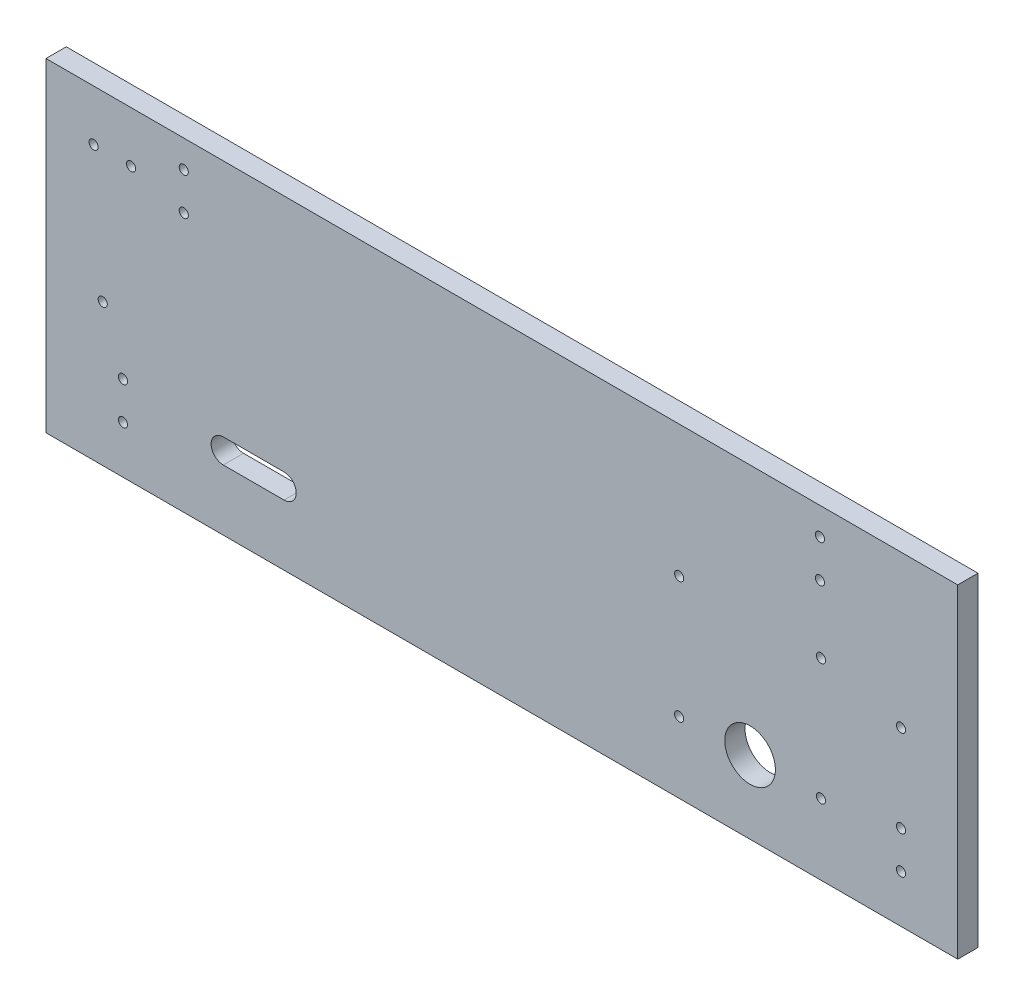
ISO-10303-21;
HEADER;
FILE_DESCRIPTION(('STEP AP214'),'2;1');
FILE_NAME('part.step','',(''),(''),'','','');
FILE_SCHEMA(('AUTOMOTIVE_DESIGN { 1 0 10303 214 1 1 1 1 }'));
ENDSEC;
DATA;
#1=APPLICATION_CONTEXT('core data for automotive mechanical design processes');
#2=APPLICATION_PROTOCOL_DEFINITION('international standard','automotive_design',2000,#1);
#3=PRODUCT_CONTEXT('',#1,'mechanical');
#4=PRODUCT('Part','Part','',(#3));
#5=PRODUCT_RELATED_PRODUCT_CATEGORY('part','',(#4));
#6=PRODUCT_DEFINITION_FORMATION('','',#4);
#7=PRODUCT_DEFINITION_CONTEXT('part definition',#1,'design');
#8=PRODUCT_DEFINITION('design','',#6,#7);
#9=PRODUCT_DEFINITION_SHAPE('','',#8);
#10=(LENGTH_UNIT() NAMED_UNIT(*) SI_UNIT(.MILLI.,.METRE.));
#11=(NAMED_UNIT(*) PLANE_ANGLE_UNIT() SI_UNIT($,.RADIAN.));
#12=(NAMED_UNIT(*) SI_UNIT($,.STERADIAN.) SOLID_ANGLE_UNIT());
#13=UNCERTAINTY_MEASURE_WITH_UNIT(LENGTH_MEASURE(1.E-05),#10,'distance_accuracy_value','');
#14=(GEOMETRIC_REPRESENTATION_CONTEXT(3) GLOBAL_UNCERTAINTY_ASSIGNED_CONTEXT((#13)) GLOBAL_UNIT_ASSIGNED_CONTEXT((#10,
#11,#12)) REPRESENTATION_CONTEXT('',''));
#15=CARTESIAN_POINT('',(0.,0.,0.));
#16=DIRECTION('',(0.,0.,1.));
#17=DIRECTION('',(1.,0.,0.));
#18=AXIS2_PLACEMENT_3D('',#15,#16,#17);
#19=CARTESIAN_POINT('',(0.,0.,10.));
#20=DIRECTION('',(1.,0.,0.));
#21=DIRECTION('',(0.,0.,-1.));
#22=AXIS2_PLACEMENT_3D('',#19,#20,#21);
#23=PLANE('',#22);
#24=DIRECTION('',(0.,-1.,0.));
#25=VECTOR('',#24,1.);
#26=CARTESIAN_POINT('',(0.,0.,0.));
#27=LINE('',#26,#25);
#28=CARTESIAN_POINT('',(0.,160.,0.));
#29=VERTEX_POINT('',#28);
#30=CARTESIAN_POINT('',(0.,0.,0.));
#31=VERTEX_POINT('',#30);
#32=EDGE_CURVE('E158',#29,#31,#27,.T.);
#33=ORIENTED_EDGE('',*,*,#32,.T.);
#34=DIRECTION('',(0.,0.,-1.));
#35=VECTOR('',#34,1.);
#36=CARTESIAN_POINT('',(0.,0.,10.));
#37=LINE('',#36,#35);
#38=CARTESIAN_POINT('',(0.,0.,10.));
#39=VERTEX_POINT('',#38);
#40=EDGE_CURVE('E11',#39,#31,#37,.T.);
#41=ORIENTED_EDGE('',*,*,#40,.F.);
#42=DIRECTION('',(0.,-1.,0.));
#43=VECTOR('',#42,1.);
#44=CARTESIAN_POINT('',(0.,0.,10.));
#45=LINE('',#44,#43);
#46=CARTESIAN_POINT('',(0.,160.,10.));
#47=VERTEX_POINT('',#46);
#48=EDGE_CURVE('E160',#47,#39,#45,.T.);
#49=ORIENTED_EDGE('',*,*,#48,.F.);
#50=DIRECTION('',(0.,0.,-1.));
#51=VECTOR('',#50,1.);
#52=CARTESIAN_POINT('',(0.,160.,10.));
#53=LINE('',#52,#51);
#54=EDGE_CURVE('E170',#47,#29,#53,.T.);
#55=ORIENTED_EDGE('',*,*,#54,.T.);
#56=EDGE_LOOP('',(#33,#41,#49,#55));
#57=FACE_BOUND('',#56,.T.);
#58=ADVANCED_FACE('F37',(#57),#23,.F.);
#59=CARTESIAN_POINT('',(0.,0.,10.));
#60=DIRECTION('',(0.,1.,0.));
#61=DIRECTION('',(0.,0.,1.));
#62=AXIS2_PLACEMENT_3D('',#59,#60,#61);
#63=PLANE('',#62);
#64=DIRECTION('',(1.,0.,0.));
#65=VECTOR('',#64,1.);
#66=CARTESIAN_POINT('',(0.,0.,0.));
#67=LINE('',#66,#65);
#68=CARTESIAN_POINT('',(450.,0.,0.));
#69=VERTEX_POINT('',#68);
#70=EDGE_CURVE('E173',#31,#69,#67,.T.);
#71=ORIENTED_EDGE('',*,*,#70,.T.);
#72=DIRECTION('',(0.,0.,-1.));
#73=VECTOR('',#72,1.);
#74=CARTESIAN_POINT('',(450.,0.,10.));
#75=LINE('',#74,#73);
#76=CARTESIAN_POINT('',(450.,0.,10.));
#77=VERTEX_POINT('',#76);
#78=EDGE_CURVE('E44',#77,#69,#75,.T.);
#79=ORIENTED_EDGE('',*,*,#78,.F.);
#80=DIRECTION('',(1.,0.,0.));
#81=VECTOR('',#80,1.);
#82=CARTESIAN_POINT('',(0.,0.,10.));
#83=LINE('',#82,#81);
#84=EDGE_CURVE('E163',#39,#77,#83,.T.);
#85=ORIENTED_EDGE('',*,*,#84,.F.);
#86=ORIENTED_EDGE('',*,*,#40,.T.);
#87=EDGE_LOOP('',(#71,#79,#85,#86));
#88=FACE_BOUND('',#87,.T.);
#89=ADVANCED_FACE('F202',(#88),#63,.F.);
#90=CARTESIAN_POINT('',(450.,0.,10.));
#91=DIRECTION('',(-1.,0.,0.));
#92=DIRECTION('',(0.,0.,1.));
#93=AXIS2_PLACEMENT_3D('',#90,#91,#92);
#94=PLANE('',#93);
#95=DIRECTION('',(0.,1.,0.));
#96=VECTOR('',#95,1.);
#97=CARTESIAN_POINT('',(450.,0.,0.));
#98=LINE('',#97,#96);
#99=CARTESIAN_POINT('',(450.,160.,0.));
#100=VERTEX_POINT('',#99);
#101=EDGE_CURVE('E175',#69,#100,#98,.T.);
#102=ORIENTED_EDGE('',*,*,#101,.T.);
#103=DIRECTION('',(0.,0.,-1.));
#104=VECTOR('',#103,1.);
#105=CARTESIAN_POINT('',(450.,160.,10.));
#106=LINE('',#105,#104);
#107=CARTESIAN_POINT('',(450.,160.,10.));
#108=VERTEX_POINT('',#107);
#109=EDGE_CURVE('E180',#108,#100,#106,.T.);
#110=ORIENTED_EDGE('',*,*,#109,.F.);
#111=DIRECTION('',(0.,1.,0.));
#112=VECTOR('',#111,1.);
#113=CARTESIAN_POINT('',(450.,0.,10.));
#114=LINE('',#113,#112);
#115=EDGE_CURVE('E166',#77,#108,#114,.T.);
#116=ORIENTED_EDGE('',*,*,#115,.F.);
#117=ORIENTED_EDGE('',*,*,#78,.T.);
#118=EDGE_LOOP('',(#102,#110,#116,#117));
#119=FACE_BOUND('',#118,.T.);
#120=ADVANCED_FACE('F187',(#119),#94,.F.);
#121=CARTESIAN_POINT('',(0.,160.,10.));
#122=DIRECTION('',(0.,-1.,0.));
#123=DIRECTION('',(0.,0.,-1.));
#124=AXIS2_PLACEMENT_3D('',#121,#122,#123);
#125=PLANE('',#124);
#126=DIRECTION('',(-1.,0.,0.));
#127=VECTOR('',#126,1.);
#128=CARTESIAN_POINT('',(0.,160.,0.));
#129=LINE('',#128,#127);
#130=EDGE_CURVE('E164',#100,#29,#129,.T.);
#131=ORIENTED_EDGE('',*,*,#130,.T.);
#132=ORIENTED_EDGE('',*,*,#54,.F.);
#133=DIRECTION('',(-1.,0.,0.));
#134=VECTOR('',#133,1.);
#135=CARTESIAN_POINT('',(0.,160.,10.));
#136=LINE('',#135,#134);
#137=EDGE_CURVE('E168',#108,#47,#136,.T.);
#138=ORIENTED_EDGE('',*,*,#137,.F.);
#139=ORIENTED_EDGE('',*,*,#109,.T.);
#140=EDGE_LOOP('',(#131,#132,#138,#139));
#141=FACE_BOUND('',#140,.T.);
#142=ADVANCED_FACE('F196',(#141),#125,.F.);
#143=CARTESIAN_POINT('',(0.,0.,10.));
#144=DIRECTION('',(0.,0.,-1.));
#145=DIRECTION('',(-1.,0.,0.));
#146=AXIS2_PLACEMENT_3D('',#143,#144,#145);
#147=PLANE('',#146);
#148=CARTESIAN_POINT('',(382.,146.5,10.));
#149=DIRECTION('',(0.,0.,1.));
#150=DIRECTION('',(1.,0.,0.));
#151=AXIS2_PLACEMENT_3D('',#148,#149,#150);
#152=CIRCLE('',#151,2.24999999999996);
#153=CARTESIAN_POINT('',(384.25,146.5,10.));
#154=VERTEX_POINT('',#153);
#155=EDGE_CURVE('E341',#154,#154,#152,.T.);
#156=ORIENTED_EDGE('',*,*,#155,.F.);
#157=EDGE_LOOP('',(#156));
#158=FACE_BOUND('',#157,.T.);
#159=CARTESIAN_POINT('',(68.,128.,10.));
#160=DIRECTION('',(0.,0.,1.));
#161=DIRECTION('',(1.,0.,0.));
#162=AXIS2_PLACEMENT_3D('',#159,#160,#161);
#163=CIRCLE('',#162,2.25);
#164=CARTESIAN_POINT('',(70.25,128.,10.));
#165=VERTEX_POINT('',#164);
#166=EDGE_CURVE('E334',#165,#165,#163,.T.);
#167=ORIENTED_EDGE('',*,*,#166,.F.);
#168=EDGE_LOOP('',(#167));
#169=FACE_BOUND('',#168,.T.);
#170=CARTESIAN_POINT('',(422.,85.,10.));
#171=DIRECTION('',(0.,0.,1.));
#172=DIRECTION('',(1.,0.,0.));
#173=AXIS2_PLACEMENT_3D('',#170,#171,#172);
#174=CIRCLE('',#173,2.24999999999995);
#175=CARTESIAN_POINT('',(424.25,85.,10.));
#176=VERTEX_POINT('',#175);
#177=EDGE_CURVE('E353',#176,#176,#174,.T.);
#178=ORIENTED_EDGE('',*,*,#177,.F.);
#179=EDGE_LOOP('',(#178));
#180=FACE_BOUND('',#179,.T.);
#181=CARTESIAN_POINT('',(68.,146.5,10.));
#182=DIRECTION('',(0.,0.,1.));
#183=DIRECTION('',(1.,0.,0.));
#184=AXIS2_PLACEMENT_3D('',#181,#182,#183);
#185=CIRCLE('',#184,2.25);
#186=CARTESIAN_POINT('',(70.25,146.5,10.));
#187=VERTEX_POINT('',#186);
#188=EDGE_CURVE('E346',#187,#187,#185,.T.);
#189=ORIENTED_EDGE('',*,*,#188,.F.);
#190=EDGE_LOOP('',(#189));
#191=FACE_BOUND('',#190,.T.);
#192=CARTESIAN_POINT('',(422.,41.9999999999999,10.));
#193=DIRECTION('',(0.,0.,1.));
#194=DIRECTION('',(1.,0.,0.));
#195=AXIS2_PLACEMENT_3D('',#192,#193,#194);
#196=CIRCLE('',#195,2.24999999999995);
#197=CARTESIAN_POINT('',(424.25,41.9999999999999,10.));
#198=VERTEX_POINT('',#197);
#199=EDGE_CURVE('E309',#198,#198,#196,.T.);
#200=ORIENTED_EDGE('',*,*,#199,.F.);
#201=EDGE_LOOP('',(#200));
#202=FACE_BOUND('',#201,.T.);
#203=CARTESIAN_POINT('',(38.,23.5,10.));
#204=DIRECTION('',(0.,0.,1.));
#205=DIRECTION('',(1.,0.,0.));
#206=AXIS2_PLACEMENT_3D('',#203,#204,#205);
#207=CIRCLE('',#206,2.25);
#208=CARTESIAN_POINT('',(40.25,23.5,10.));
#209=VERTEX_POINT('',#208);
#210=EDGE_CURVE('E313',#209,#209,#207,.T.);
#211=ORIENTED_EDGE('',*,*,#210,.F.);
#212=EDGE_LOOP('',(#211));
#213=FACE_BOUND('',#212,.T.);
#214=CARTESIAN_POINT('',(38.,42.,10.));
#215=DIRECTION('',(0.,0.,1.));
#216=DIRECTION('',(1.,0.,0.));
#217=AXIS2_PLACEMENT_3D('',#214,#215,#216);
#218=CIRCLE('',#217,2.25);
#219=CARTESIAN_POINT('',(40.25,42.,10.));
#220=VERTEX_POINT('',#219);
#221=EDGE_CURVE('E329',#220,#220,#218,.T.);
#222=ORIENTED_EDGE('',*,*,#221,.F.);
#223=EDGE_LOOP('',(#222));
#224=FACE_BOUND('',#223,.T.);
#225=CARTESIAN_POINT('',(382.,128.,10.));
#226=DIRECTION('',(0.,0.,1.));
#227=DIRECTION('',(1.,0.,0.));
#228=AXIS2_PLACEMENT_3D('',#225,#226,#227);
#229=CIRCLE('',#228,2.24999999999996);
#230=CARTESIAN_POINT('',(384.25,128.,10.));
#231=VERTEX_POINT('',#230);
#232=EDGE_CURVE('E322',#231,#231,#229,.T.);
#233=ORIENTED_EDGE('',*,*,#232,.F.);
#234=EDGE_LOOP('',(#233));
#235=FACE_BOUND('',#234,.T.);
#236=DIRECTION('',(1.,0.,0.));
#237=VECTOR('',#236,1.);
#238=CARTESIAN_POINT('',(87.5,30.,10.));
#239=LINE('',#238,#237);
#240=CARTESIAN_POINT('',(87.5,30.,10.));
#241=VERTEX_POINT('',#240);
#242=CARTESIAN_POINT('',(117.5,30.,10.));
#243=VERTEX_POINT('',#242);
#244=EDGE_CURVE('E122',#241,#243,#239,.T.);
#245=ORIENTED_EDGE('',*,*,#244,.F.);
#246=CARTESIAN_POINT('',(87.5,36.,10.));
#247=DIRECTION('',(0.,0.,1.));
#248=DIRECTION('',(1.,0.,0.));
#249=AXIS2_PLACEMENT_3D('',#246,#247,#248);
#250=CIRCLE('',#249,6.);
#251=CARTESIAN_POINT('',(87.5,42.,10.));
#252=VERTEX_POINT('',#251);
#253=EDGE_CURVE('E51',#252,#241,#250,.T.);
#254=ORIENTED_EDGE('',*,*,#253,.F.);
#255=DIRECTION('',(-1.,0.,0.));
#256=VECTOR('',#255,1.);
#257=CARTESIAN_POINT('',(87.5,42.,10.));
#258=LINE('',#257,#256);
#259=CARTESIAN_POINT('',(117.5,42.,10.));
#260=VERTEX_POINT('',#259);
#261=EDGE_CURVE('E111',#260,#252,#258,.T.);
#262=ORIENTED_EDGE('',*,*,#261,.F.);
#263=CARTESIAN_POINT('',(117.5,36.,10.));
#264=DIRECTION('',(0.,0.,1.));
#265=DIRECTION('',(1.,0.,0.));
#266=AXIS2_PLACEMENT_3D('',#263,#264,#265);
#267=CIRCLE('',#266,6.);
#268=EDGE_CURVE('E116',#243,#260,#267,.T.);
#269=ORIENTED_EDGE('',*,*,#268,.F.);
#270=EDGE_LOOP('',(#245,#254,#262,#269));
#271=FACE_BOUND('',#270,.T.);
#272=CARTESIAN_POINT('',(312.5,94.9999999999999,10.));
#273=DIRECTION('',(0.,0.,1.));
#274=DIRECTION('',(1.,0.,0.));
#275=AXIS2_PLACEMENT_3D('',#272,#273,#274);
#276=CIRCLE('',#275,2.24999999999995);
#277=CARTESIAN_POINT('',(314.75,94.9999999999999,10.));
#278=VERTEX_POINT('',#277);
#279=EDGE_CURVE('E108',#278,#278,#276,.T.);
#280=ORIENTED_EDGE('',*,*,#279,.F.);
#281=EDGE_LOOP('',(#280));
#282=FACE_BOUND('',#281,.T.);
#283=CARTESIAN_POINT('',(382.5,94.9999999999999,10.));
#284=DIRECTION('',(0.,0.,1.));
#285=DIRECTION('',(1.,0.,0.));
#286=AXIS2_PLACEMENT_3D('',#283,#284,#285);
#287=CIRCLE('',#286,2.24999999999995);
#288=CARTESIAN_POINT('',(384.75,94.9999999999999,10.));
#289=VERTEX_POINT('',#288);
#290=EDGE_CURVE('E144',#289,#289,#287,.T.);
#291=ORIENTED_EDGE('',*,*,#290,.F.);
#292=EDGE_LOOP('',(#291));
#293=FACE_BOUND('',#292,.T.);
#294=CARTESIAN_POINT('',(382.5,34.9999999999999,10.));
#295=DIRECTION('',(0.,0.,1.));
#296=DIRECTION('',(1.,0.,0.));
#297=AXIS2_PLACEMENT_3D('',#294,#295,#296);
#298=CIRCLE('',#297,2.24999999999995);
#299=CARTESIAN_POINT('',(384.75,34.9999999999999,10.));
#300=VERTEX_POINT('',#299);
#301=EDGE_CURVE('E150',#300,#300,#298,.T.);
#302=ORIENTED_EDGE('',*,*,#301,.F.);
#303=EDGE_LOOP('',(#302));
#304=FACE_BOUND('',#303,.T.);
#305=CARTESIAN_POINT('',(28.0000000000001,70.,10.));
#306=DIRECTION('',(0.,0.,1.));
#307=DIRECTION('',(1.,0.,0.));
#308=AXIS2_PLACEMENT_3D('',#305,#306,#307);
#309=CIRCLE('',#308,2.25);
#310=CARTESIAN_POINT('',(30.2500000000001,70.,10.));
#311=VERTEX_POINT('',#310);
#312=EDGE_CURVE('E365',#311,#311,#309,.T.);
#313=ORIENTED_EDGE('',*,*,#312,.F.);
#314=EDGE_LOOP('',(#313));
#315=FACE_BOUND('',#314,.T.);
#316=CARTESIAN_POINT('',(42.,134.933694221876,10.));
#317=DIRECTION('',(0.,0.,1.));
#318=DIRECTION('',(1.,0.,0.));
#319=AXIS2_PLACEMENT_3D('',#316,#317,#318);
#320=CIRCLE('',#319,2.25);
#321=CARTESIAN_POINT('',(44.25,134.933694221876,10.));
#322=VERTEX_POINT('',#321);
#323=EDGE_CURVE('E358',#322,#322,#320,.T.);
#324=ORIENTED_EDGE('',*,*,#323,.F.);
#325=EDGE_LOOP('',(#324));
#326=FACE_BOUND('',#325,.T.);
#327=CARTESIAN_POINT('',(23.5,134.933694221876,10.));
#328=DIRECTION('',(0.,0.,1.));
#329=DIRECTION('',(1.,0.,0.));
#330=AXIS2_PLACEMENT_3D('',#327,#328,#329);
#331=CIRCLE('',#330,2.25);
#332=CARTESIAN_POINT('',(25.75,134.933694221876,10.));
#333=VERTEX_POINT('',#332);
#334=EDGE_CURVE('E375',#333,#333,#331,.T.);
#335=ORIENTED_EDGE('',*,*,#334,.F.);
#336=EDGE_LOOP('',(#335));
#337=FACE_BOUND('',#336,.T.);
#338=CARTESIAN_POINT('',(312.5,34.9999999999999,10.));
#339=DIRECTION('',(0.,0.,1.));
#340=DIRECTION('',(1.,0.,0.));
#341=AXIS2_PLACEMENT_3D('',#338,#339,#340);
#342=CIRCLE('',#341,2.24999999999995);
#343=CARTESIAN_POINT('',(314.75,34.9999999999999,10.));
#344=VERTEX_POINT('',#343);
#345=EDGE_CURVE('E156',#344,#344,#342,.T.);
#346=ORIENTED_EDGE('',*,*,#345,.F.);
#347=EDGE_LOOP('',(#346));
#348=FACE_BOUND('',#347,.T.);
#349=CARTESIAN_POINT('',(422.,23.4999999999999,10.));
#350=DIRECTION('',(0.,0.,1.));
#351=DIRECTION('',(1.,0.,0.));
#352=AXIS2_PLACEMENT_3D('',#349,#350,#351);
#353=CIRCLE('',#352,2.24999999999995);
#354=CARTESIAN_POINT('',(424.25,23.4999999999999,10.));
#355=VERTEX_POINT('',#354);
#356=EDGE_CURVE('E304',#355,#355,#353,.T.);
#357=ORIENTED_EDGE('',*,*,#356,.F.);
#358=EDGE_LOOP('',(#357));
#359=FACE_BOUND('',#358,.T.);
#360=CARTESIAN_POINT('',(347.5,36.,10.));
#361=DIRECTION('',(0.,0.,1.));
#362=DIRECTION('',(1.,0.,0.));
#363=AXIS2_PLACEMENT_3D('',#360,#361,#362);
#364=CIRCLE('',#363,12.5);
#365=CARTESIAN_POINT('',(360.,36.,10.));
#366=VERTEX_POINT('',#365);
#367=EDGE_CURVE('E123',#366,#366,#364,.T.);
#368=ORIENTED_EDGE('',*,*,#367,.F.);
#369=EDGE_LOOP('',(#368));
#370=FACE_BOUND('',#369,.T.);
#371=ORIENTED_EDGE('',*,*,#48,.T.);
#372=ORIENTED_EDGE('',*,*,#84,.T.);
#373=ORIENTED_EDGE('',*,*,#115,.T.);
#374=ORIENTED_EDGE('',*,*,#137,.T.);
#375=EDGE_LOOP('',(#371,#372,#373,#374));
#376=FACE_BOUND('',#375,.T.);
#377=ADVANCED_FACE('F119',(#158,#169,#180,#191,#202,#213,#224,#235,#271,#282,#293,#304,#315,
#326,#337,#348,#359,#370,#376),#147,.F.);
#378=CARTESIAN_POINT('',(0.,0.,0.));
#379=DIRECTION('',(0.,0.,-1.));
#380=DIRECTION('',(-1.,0.,0.));
#381=AXIS2_PLACEMENT_3D('',#378,#379,#380);
#382=PLANE('',#381);
#383=CARTESIAN_POINT('',(382.,146.5,0.));
#384=DIRECTION('',(0.,0.,1.));
#385=DIRECTION('',(1.,0.,0.));
#386=AXIS2_PLACEMENT_3D('',#383,#384,#385);
#387=CIRCLE('',#386,2.24999999999996);
#388=CARTESIAN_POINT('',(384.25,146.5,0.));
#389=VERTEX_POINT('',#388);
#390=EDGE_CURVE('E325',#389,#389,#387,.T.);
#391=ORIENTED_EDGE('',*,*,#390,.T.);
#392=EDGE_LOOP('',(#391));
#393=FACE_BOUND('',#392,.T.);
#394=CARTESIAN_POINT('',(68.,128.,0.));
#395=DIRECTION('',(0.,0.,1.));
#396=DIRECTION('',(1.,0.,0.));
#397=AXIS2_PLACEMENT_3D('',#394,#395,#396);
#398=CIRCLE('',#397,2.25);
#399=CARTESIAN_POINT('',(70.25,128.,0.));
#400=VERTEX_POINT('',#399);
#401=EDGE_CURVE('E338',#400,#400,#398,.T.);
#402=ORIENTED_EDGE('',*,*,#401,.T.);
#403=EDGE_LOOP('',(#402));
#404=FACE_BOUND('',#403,.T.);
#405=CARTESIAN_POINT('',(422.,85.,0.));
#406=DIRECTION('',(0.,0.,1.));
#407=DIRECTION('',(1.,0.,0.));
#408=AXIS2_PLACEMENT_3D('',#405,#406,#407);
#409=CIRCLE('',#408,2.24999999999995);
#410=CARTESIAN_POINT('',(424.25,85.,0.));
#411=VERTEX_POINT('',#410);
#412=EDGE_CURVE('E337',#411,#411,#409,.T.);
#413=ORIENTED_EDGE('',*,*,#412,.T.);
#414=EDGE_LOOP('',(#413));
#415=FACE_BOUND('',#414,.T.);
#416=CARTESIAN_POINT('',(68.,146.5,0.));
#417=DIRECTION('',(0.,0.,1.));
#418=DIRECTION('',(1.,0.,0.));
#419=AXIS2_PLACEMENT_3D('',#416,#417,#418);
#420=CIRCLE('',#419,2.25);
#421=CARTESIAN_POINT('',(70.25,146.5,0.));
#422=VERTEX_POINT('',#421);
#423=EDGE_CURVE('E350',#422,#422,#420,.T.);
#424=ORIENTED_EDGE('',*,*,#423,.T.);
#425=EDGE_LOOP('',(#424));
#426=FACE_BOUND('',#425,.T.);
#427=CARTESIAN_POINT('',(422.,41.9999999999999,0.));
#428=DIRECTION('',(0.,0.,1.));
#429=DIRECTION('',(1.,0.,0.));
#430=AXIS2_PLACEMENT_3D('',#427,#428,#429);
#431=CIRCLE('',#430,2.24999999999995);
#432=CARTESIAN_POINT('',(424.25,41.9999999999999,0.));
#433=VERTEX_POINT('',#432);
#434=EDGE_CURVE('E306',#433,#433,#431,.T.);
#435=ORIENTED_EDGE('',*,*,#434,.T.);
#436=EDGE_LOOP('',(#435));
#437=FACE_BOUND('',#436,.T.);
#438=CARTESIAN_POINT('',(38.,23.5,0.));
#439=DIRECTION('',(0.,0.,1.));
#440=DIRECTION('',(1.,0.,0.));
#441=AXIS2_PLACEMENT_3D('',#438,#439,#440);
#442=CIRCLE('',#441,2.25);
#443=CARTESIAN_POINT('',(40.25,23.5,0.));
#444=VERTEX_POINT('',#443);
#445=EDGE_CURVE('E317',#444,#444,#442,.T.);
#446=ORIENTED_EDGE('',*,*,#445,.T.);
#447=EDGE_LOOP('',(#446));
#448=FACE_BOUND('',#447,.T.);
#449=CARTESIAN_POINT('',(38.,42.,0.));
#450=DIRECTION('',(0.,0.,1.));
#451=DIRECTION('',(1.,0.,0.));
#452=AXIS2_PLACEMENT_3D('',#449,#450,#451);
#453=CIRCLE('',#452,2.25);
#454=CARTESIAN_POINT('',(40.25,42.,0.));
#455=VERTEX_POINT('',#454);
#456=EDGE_CURVE('E316',#455,#455,#453,.T.);
#457=ORIENTED_EDGE('',*,*,#456,.T.);
#458=EDGE_LOOP('',(#457));
#459=FACE_BOUND('',#458,.T.);
#460=CARTESIAN_POINT('',(382.,128.,0.));
#461=DIRECTION('',(0.,0.,1.));
#462=DIRECTION('',(1.,0.,0.));
#463=AXIS2_PLACEMENT_3D('',#460,#461,#462);
#464=CIRCLE('',#463,2.24999999999996);
#465=CARTESIAN_POINT('',(384.25,128.,0.));
#466=VERTEX_POINT('',#465);
#467=EDGE_CURVE('E326',#466,#466,#464,.T.);
#468=ORIENTED_EDGE('',*,*,#467,.T.);
#469=EDGE_LOOP('',(#468));
#470=FACE_BOUND('',#469,.T.);
#471=CARTESIAN_POINT('',(87.5,36.,0.));
#472=DIRECTION('',(0.,0.,1.));
#473=DIRECTION('',(1.,0.,0.));
#474=AXIS2_PLACEMENT_3D('',#471,#472,#473);
#475=CIRCLE('',#474,6.);
#476=CARTESIAN_POINT('',(87.5,42.,0.));
#477=VERTEX_POINT('',#476);
#478=CARTESIAN_POINT('',(87.5,30.,0.));
#479=VERTEX_POINT('',#478);
#480=EDGE_CURVE('E103',#477,#479,#475,.T.);
#481=ORIENTED_EDGE('',*,*,#480,.T.);
#482=DIRECTION('',(1.,0.,0.));
#483=VECTOR('',#482,1.);
#484=CARTESIAN_POINT('',(87.5,30.,0.));
#485=LINE('',#484,#483);
#486=CARTESIAN_POINT('',(117.5,30.,0.));
#487=VERTEX_POINT('',#486);
#488=EDGE_CURVE('E135',#479,#487,#485,.T.);
#489=ORIENTED_EDGE('',*,*,#488,.T.);
#490=CARTESIAN_POINT('',(117.5,36.,0.));
#491=DIRECTION('',(0.,0.,1.));
#492=DIRECTION('',(1.,0.,0.));
#493=AXIS2_PLACEMENT_3D('',#490,#491,#492);
#494=CIRCLE('',#493,6.);
#495=CARTESIAN_POINT('',(117.5,42.,0.));
#496=VERTEX_POINT('',#495);
#497=EDGE_CURVE('E59',#487,#496,#494,.T.);
#498=ORIENTED_EDGE('',*,*,#497,.T.);
#499=DIRECTION('',(-1.,0.,0.));
#500=VECTOR('',#499,1.);
#501=CARTESIAN_POINT('',(87.5,42.,0.));
#502=LINE('',#501,#500);
#503=EDGE_CURVE('E131',#496,#477,#502,.T.);
#504=ORIENTED_EDGE('',*,*,#503,.T.);
#505=EDGE_LOOP('',(#481,#489,#498,#504));
#506=FACE_BOUND('',#505,.T.);
#507=CARTESIAN_POINT('',(312.5,94.9999999999999,0.));
#508=DIRECTION('',(0.,0.,1.));
#509=DIRECTION('',(1.,0.,0.));
#510=AXIS2_PLACEMENT_3D('',#507,#508,#509);
#511=CIRCLE('',#510,2.24999999999995);
#512=CARTESIAN_POINT('',(314.75,94.9999999999999,0.));
#513=VERTEX_POINT('',#512);
#514=EDGE_CURVE('E141',#513,#513,#511,.T.);
#515=ORIENTED_EDGE('',*,*,#514,.T.);
#516=EDGE_LOOP('',(#515));
#517=FACE_BOUND('',#516,.T.);
#518=CARTESIAN_POINT('',(382.5,94.9999999999999,0.));
#519=DIRECTION('',(0.,0.,1.));
#520=DIRECTION('',(1.,0.,0.));
#521=AXIS2_PLACEMENT_3D('',#518,#519,#520);
#522=CIRCLE('',#521,2.24999999999995);
#523=CARTESIAN_POINT('',(384.75,94.9999999999999,0.));
#524=VERTEX_POINT('',#523);
#525=EDGE_CURVE('E147',#524,#524,#522,.T.);
#526=ORIENTED_EDGE('',*,*,#525,.T.);
#527=EDGE_LOOP('',(#526));
#528=FACE_BOUND('',#527,.T.);
#529=CARTESIAN_POINT('',(382.5,34.9999999999999,0.));
#530=DIRECTION('',(0.,0.,1.));
#531=DIRECTION('',(1.,0.,0.));
#532=AXIS2_PLACEMENT_3D('',#529,#530,#531);
#533=CIRCLE('',#532,2.24999999999995);
#534=CARTESIAN_POINT('',(384.75,34.9999999999999,0.));
#535=VERTEX_POINT('',#534);
#536=EDGE_CURVE('E153',#535,#535,#533,.T.);
#537=ORIENTED_EDGE('',*,*,#536,.T.);
#538=EDGE_LOOP('',(#537));
#539=FACE_BOUND('',#538,.T.);
#540=CARTESIAN_POINT('',(28.0000000000001,70.,0.));
#541=DIRECTION('',(0.,0.,1.));
#542=DIRECTION('',(1.,0.,0.));
#543=AXIS2_PLACEMENT_3D('',#540,#541,#542);
#544=CIRCLE('',#543,2.25);
#545=CARTESIAN_POINT('',(30.2500000000001,70.,0.));
#546=VERTEX_POINT('',#545);
#547=EDGE_CURVE('E349',#546,#546,#544,.T.);
#548=ORIENTED_EDGE('',*,*,#547,.T.);
#549=EDGE_LOOP('',(#548));
#550=FACE_BOUND('',#549,.T.);
#551=CARTESIAN_POINT('',(42.,134.933694221876,0.));
#552=DIRECTION('',(0.,0.,1.));
#553=DIRECTION('',(1.,0.,0.));
#554=AXIS2_PLACEMENT_3D('',#551,#552,#553);
#555=CIRCLE('',#554,2.25);
#556=CARTESIAN_POINT('',(44.25,134.933694221876,0.));
#557=VERTEX_POINT('',#556);
#558=EDGE_CURVE('E362',#557,#557,#555,.T.);
#559=ORIENTED_EDGE('',*,*,#558,.T.);
#560=EDGE_LOOP('',(#559));
#561=FACE_BOUND('',#560,.T.);
#562=CARTESIAN_POINT('',(23.5,134.933694221876,0.));
#563=DIRECTION('',(0.,0.,1.));
#564=DIRECTION('',(1.,0.,0.));
#565=AXIS2_PLACEMENT_3D('',#562,#563,#564);
#566=CIRCLE('',#565,2.25);
#567=CARTESIAN_POINT('',(25.75,134.933694221876,0.));
#568=VERTEX_POINT('',#567);
#569=EDGE_CURVE('E361',#568,#568,#566,.T.);
#570=ORIENTED_EDGE('',*,*,#569,.T.);
#571=EDGE_LOOP('',(#570));
#572=FACE_BOUND('',#571,.T.);
#573=CARTESIAN_POINT('',(312.5,34.9999999999999,0.));
#574=DIRECTION('',(0.,0.,1.));
#575=DIRECTION('',(1.,0.,0.));
#576=AXIS2_PLACEMENT_3D('',#573,#574,#575);
#577=CIRCLE('',#576,2.24999999999995);
#578=CARTESIAN_POINT('',(314.75,34.9999999999999,0.));
#579=VERTEX_POINT('',#578);
#580=EDGE_CURVE('E372',#579,#579,#577,.T.);
#581=ORIENTED_EDGE('',*,*,#580,.T.);
#582=EDGE_LOOP('',(#581));
#583=FACE_BOUND('',#582,.T.);
#584=CARTESIAN_POINT('',(422.,23.4999999999999,0.));
#585=DIRECTION('',(0.,0.,1.));
#586=DIRECTION('',(1.,0.,0.));
#587=AXIS2_PLACEMENT_3D('',#584,#585,#586);
#588=CIRCLE('',#587,2.24999999999995);
#589=CARTESIAN_POINT('',(424.25,23.4999999999999,0.));
#590=VERTEX_POINT('',#589);
#591=EDGE_CURVE('E301',#590,#590,#588,.T.);
#592=ORIENTED_EDGE('',*,*,#591,.T.);
#593=EDGE_LOOP('',(#592));
#594=FACE_BOUND('',#593,.T.);
#595=CARTESIAN_POINT('',(347.5,36.,0.));
#596=DIRECTION('',(0.,0.,1.));
#597=DIRECTION('',(1.,0.,0.));
#598=AXIS2_PLACEMENT_3D('',#595,#596,#597);
#599=CIRCLE('',#598,12.5);
#600=CARTESIAN_POINT('',(360.,36.,0.));
#601=VERTEX_POINT('',#600);
#602=EDGE_CURVE('E126',#601,#601,#599,.T.);
#603=ORIENTED_EDGE('',*,*,#602,.T.);
#604=EDGE_LOOP('',(#603));
#605=FACE_BOUND('',#604,.T.);
#606=ORIENTED_EDGE('',*,*,#32,.F.);
#607=ORIENTED_EDGE('',*,*,#130,.F.);
#608=ORIENTED_EDGE('',*,*,#101,.F.);
#609=ORIENTED_EDGE('',*,*,#70,.F.);
#610=EDGE_LOOP('',(#606,#607,#608,#609));
#611=FACE_BOUND('',#610,.T.);
#612=ADVANCED_FACE('F193',(#393,#404,#415,#426,#437,#448,#459,#470,#506,#517,#528,#539,#550,
#561,#572,#583,#594,#605,#611),#382,.T.);
#613=CARTESIAN_POINT('',(347.5,36.,0.));
#614=DIRECTION('',(0.,0.,1.));
#615=DIRECTION('',(1.,0.,0.));
#616=AXIS2_PLACEMENT_3D('',#613,#614,#615);
#617=CYLINDRICAL_SURFACE('',#616,12.5);
#618=ORIENTED_EDGE('',*,*,#602,.F.);
#619=EDGE_LOOP('',(#618));
#620=FACE_BOUND('',#619,.T.);
#621=ORIENTED_EDGE('',*,*,#367,.T.);
#622=EDGE_LOOP('',(#621));
#623=FACE_BOUND('',#622,.T.);
#624=ADVANCED_FACE('F214',(#620,#623),#617,.F.);
#625=CARTESIAN_POINT('',(422.,23.4999999999999,0.));
#626=DIRECTION('',(0.,0.,1.));
#627=DIRECTION('',(1.,0.,0.));
#628=AXIS2_PLACEMENT_3D('',#625,#626,#627);
#629=CYLINDRICAL_SURFACE('',#628,2.24999999999995);
#630=ORIENTED_EDGE('',*,*,#591,.F.);
#631=EDGE_LOOP('',(#630));
#632=FACE_BOUND('',#631,.T.);
#633=ORIENTED_EDGE('',*,*,#356,.T.);
#634=EDGE_LOOP('',(#633));
#635=FACE_BOUND('',#634,.T.);
#636=ADVANCED_FACE('F221',(#632,#635),#629,.F.);
#637=CARTESIAN_POINT('',(312.5,34.9999999999999,0.));
#638=DIRECTION('',(0.,0.,1.));
#639=DIRECTION('',(1.,0.,0.));
#640=AXIS2_PLACEMENT_3D('',#637,#638,#639);
#641=CYLINDRICAL_SURFACE('',#640,2.24999999999995);
#642=ORIENTED_EDGE('',*,*,#580,.F.);
#643=EDGE_LOOP('',(#642));
#644=FACE_BOUND('',#643,.T.);
#645=ORIENTED_EDGE('',*,*,#345,.T.);
#646=EDGE_LOOP('',(#645));
#647=FACE_BOUND('',#646,.T.);
#648=ADVANCED_FACE('F252',(#644,#647),#641,.F.);
#649=CARTESIAN_POINT('',(23.5,134.933694221876,0.));
#650=DIRECTION('',(0.,0.,1.));
#651=DIRECTION('',(1.,0.,0.));
#652=AXIS2_PLACEMENT_3D('',#649,#650,#651);
#653=CYLINDRICAL_SURFACE('',#652,2.25);
#654=ORIENTED_EDGE('',*,*,#569,.F.);
#655=EDGE_LOOP('',(#654));
#656=FACE_BOUND('',#655,.T.);
#657=ORIENTED_EDGE('',*,*,#334,.T.);
#658=EDGE_LOOP('',(#657));
#659=FACE_BOUND('',#658,.T.);
#660=ADVANCED_FACE('F248',(#656,#659),#653,.F.);
#661=CARTESIAN_POINT('',(42.,134.933694221876,0.));
#662=DIRECTION('',(0.,0.,1.));
#663=DIRECTION('',(1.,0.,0.));
#664=AXIS2_PLACEMENT_3D('',#661,#662,#663);
#665=CYLINDRICAL_SURFACE('',#664,2.25);
#666=ORIENTED_EDGE('',*,*,#558,.F.);
#667=EDGE_LOOP('',(#666));
#668=FACE_BOUND('',#667,.T.);
#669=ORIENTED_EDGE('',*,*,#323,.T.);
#670=EDGE_LOOP('',(#669));
#671=FACE_BOUND('',#670,.T.);
#672=ADVANCED_FACE('F251',(#668,#671),#665,.F.);
#673=CARTESIAN_POINT('',(28.0000000000001,70.,0.));
#674=DIRECTION('',(0.,0.,1.));
#675=DIRECTION('',(1.,0.,0.));
#676=AXIS2_PLACEMENT_3D('',#673,#674,#675);
#677=CYLINDRICAL_SURFACE('',#676,2.25);
#678=ORIENTED_EDGE('',*,*,#547,.F.);
#679=EDGE_LOOP('',(#678));
#680=FACE_BOUND('',#679,.T.);
#681=ORIENTED_EDGE('',*,*,#312,.T.);
#682=EDGE_LOOP('',(#681));
#683=FACE_BOUND('',#682,.T.);
#684=ADVANCED_FACE('F227',(#680,#683),#677,.F.);
#685=CARTESIAN_POINT('',(382.5,34.9999999999999,0.));
#686=DIRECTION('',(0.,0.,1.));
#687=DIRECTION('',(1.,0.,0.));
#688=AXIS2_PLACEMENT_3D('',#685,#686,#687);
#689=CYLINDRICAL_SURFACE('',#688,2.24999999999995);
#690=ORIENTED_EDGE('',*,*,#536,.F.);
#691=EDGE_LOOP('',(#690));
#692=FACE_BOUND('',#691,.T.);
#693=ORIENTED_EDGE('',*,*,#301,.T.);
#694=EDGE_LOOP('',(#693));
#695=FACE_BOUND('',#694,.T.);
#696=ADVANCED_FACE('F223',(#692,#695),#689,.F.);
#697=CARTESIAN_POINT('',(382.5,94.9999999999999,0.));
#698=DIRECTION('',(0.,0.,1.));
#699=DIRECTION('',(1.,0.,0.));
#700=AXIS2_PLACEMENT_3D('',#697,#698,#699);
#701=CYLINDRICAL_SURFACE('',#700,2.24999999999995);
#702=ORIENTED_EDGE('',*,*,#525,.F.);
#703=EDGE_LOOP('',(#702));
#704=FACE_BOUND('',#703,.T.);
#705=ORIENTED_EDGE('',*,*,#290,.T.);
#706=EDGE_LOOP('',(#705));
#707=FACE_BOUND('',#706,.T.);
#708=ADVANCED_FACE('F226',(#704,#707),#701,.F.);
#709=CARTESIAN_POINT('',(312.5,94.9999999999999,0.));
#710=DIRECTION('',(0.,0.,1.));
#711=DIRECTION('',(1.,0.,0.));
#712=AXIS2_PLACEMENT_3D('',#709,#710,#711);
#713=CYLINDRICAL_SURFACE('',#712,2.24999999999995);
#714=ORIENTED_EDGE('',*,*,#514,.F.);
#715=EDGE_LOOP('',(#714));
#716=FACE_BOUND('',#715,.T.);
#717=ORIENTED_EDGE('',*,*,#279,.T.);
#718=EDGE_LOOP('',(#717));
#719=FACE_BOUND('',#718,.T.);
#720=ADVANCED_FACE('F231',(#716,#719),#713,.F.);
#721=CARTESIAN_POINT('',(87.5,36.,0.));
#722=DIRECTION('',(0.,0.,1.));
#723=DIRECTION('',(1.,0.,0.));
#724=AXIS2_PLACEMENT_3D('',#721,#722,#723);
#725=CYLINDRICAL_SURFACE('',#724,6.);
#726=ORIENTED_EDGE('',*,*,#253,.T.);
#727=DIRECTION('',(0.,0.,1.));
#728=VECTOR('',#727,1.);
#729=CARTESIAN_POINT('',(87.5,30.,0.));
#730=LINE('',#729,#728);
#731=EDGE_CURVE('E133',#479,#241,#730,.T.);
#732=ORIENTED_EDGE('',*,*,#731,.F.);
#733=ORIENTED_EDGE('',*,*,#480,.F.);
#734=DIRECTION('',(0.,0.,1.));
#735=VECTOR('',#734,1.);
#736=CARTESIAN_POINT('',(87.5,42.,0.));
#737=LINE('',#736,#735);
#738=EDGE_CURVE('E99',#477,#252,#737,.T.);
#739=ORIENTED_EDGE('',*,*,#738,.T.);
#740=EDGE_LOOP('',(#726,#732,#733,#739));
#741=FACE_BOUND('',#740,.T.);
#742=ADVANCED_FACE('F101',(#741),#725,.F.);
#743=CARTESIAN_POINT('',(87.5,42.,0.));
#744=DIRECTION('',(0.,1.,0.));
#745=DIRECTION('',(-1.,0.,0.));
#746=AXIS2_PLACEMENT_3D('',#743,#744,#745);
#747=PLANE('',#746);
#748=ORIENTED_EDGE('',*,*,#261,.T.);
#749=ORIENTED_EDGE('',*,*,#738,.F.);
#750=ORIENTED_EDGE('',*,*,#503,.F.);
#751=DIRECTION('',(0.,0.,1.));
#752=VECTOR('',#751,1.);
#753=CARTESIAN_POINT('',(117.5,42.,0.));
#754=LINE('',#753,#752);
#755=EDGE_CURVE('E107',#496,#260,#754,.T.);
#756=ORIENTED_EDGE('',*,*,#755,.T.);
#757=EDGE_LOOP('',(#748,#749,#750,#756));
#758=FACE_BOUND('',#757,.T.);
#759=ADVANCED_FACE('F112',(#758),#747,.F.);
#760=CARTESIAN_POINT('',(117.5,36.,0.));
#761=DIRECTION('',(0.,0.,1.));
#762=DIRECTION('',(1.,0.,0.));
#763=AXIS2_PLACEMENT_3D('',#760,#761,#762);
#764=CYLINDRICAL_SURFACE('',#763,6.);
#765=ORIENTED_EDGE('',*,*,#268,.T.);
#766=ORIENTED_EDGE('',*,*,#755,.F.);
#767=ORIENTED_EDGE('',*,*,#497,.F.);
#768=DIRECTION('',(0.,0.,1.));
#769=VECTOR('',#768,1.);
#770=CARTESIAN_POINT('',(117.5,30.,0.));
#771=LINE('',#770,#769);
#772=EDGE_CURVE('E381',#487,#243,#771,.T.);
#773=ORIENTED_EDGE('',*,*,#772,.T.);
#774=EDGE_LOOP('',(#765,#766,#767,#773));
#775=FACE_BOUND('',#774,.T.);
#776=ADVANCED_FACE('F238',(#775),#764,.F.);
#777=CARTESIAN_POINT('',(87.5,30.,0.));
#778=DIRECTION('',(0.,-1.,0.));
#779=DIRECTION('',(1.,0.,0.));
#780=AXIS2_PLACEMENT_3D('',#777,#778,#779);
#781=PLANE('',#780);
#782=ORIENTED_EDGE('',*,*,#244,.T.);
#783=ORIENTED_EDGE('',*,*,#772,.F.);
#784=ORIENTED_EDGE('',*,*,#488,.F.);
#785=ORIENTED_EDGE('',*,*,#731,.T.);
#786=EDGE_LOOP('',(#782,#783,#784,#785));
#787=FACE_BOUND('',#786,.T.);
#788=ADVANCED_FACE('F241',(#787),#781,.F.);
#789=CARTESIAN_POINT('',(382.,128.,0.));
#790=DIRECTION('',(0.,0.,1.));
#791=DIRECTION('',(1.,0.,0.));
#792=AXIS2_PLACEMENT_3D('',#789,#790,#791);
#793=CYLINDRICAL_SURFACE('',#792,2.24999999999996);
#794=ORIENTED_EDGE('',*,*,#467,.F.);
#795=EDGE_LOOP('',(#794));
#796=FACE_BOUND('',#795,.T.);
#797=ORIENTED_EDGE('',*,*,#232,.T.);
#798=EDGE_LOOP('',(#797));
#799=FACE_BOUND('',#798,.T.);
#800=ADVANCED_FACE('F244',(#796,#799),#793,.F.);
#801=CARTESIAN_POINT('',(38.,42.,0.));
#802=DIRECTION('',(0.,0.,1.));
#803=DIRECTION('',(1.,0.,0.));
#804=AXIS2_PLACEMENT_3D('',#801,#802,#803);
#805=CYLINDRICAL_SURFACE('',#804,2.25);
#806=ORIENTED_EDGE('',*,*,#456,.F.);
#807=EDGE_LOOP('',(#806));
#808=FACE_BOUND('',#807,.T.);
#809=ORIENTED_EDGE('',*,*,#221,.T.);
#810=EDGE_LOOP('',(#809));
#811=FACE_BOUND('',#810,.T.);
#812=ADVANCED_FACE('F280',(#808,#811),#805,.F.);
#813=CARTESIAN_POINT('',(38.,23.5,0.));
#814=DIRECTION('',(0.,0.,1.));
#815=DIRECTION('',(1.,0.,0.));
#816=AXIS2_PLACEMENT_3D('',#813,#814,#815);
#817=CYLINDRICAL_SURFACE('',#816,2.25);
#818=ORIENTED_EDGE('',*,*,#445,.F.);
#819=EDGE_LOOP('',(#818));
#820=FACE_BOUND('',#819,.T.);
#821=ORIENTED_EDGE('',*,*,#210,.T.);
#822=EDGE_LOOP('',(#821));
#823=FACE_BOUND('',#822,.T.);
#824=ADVANCED_FACE('F283',(#820,#823),#817,.F.);
#825=CARTESIAN_POINT('',(422.,41.9999999999999,0.));
#826=DIRECTION('',(0.,0.,1.));
#827=DIRECTION('',(1.,0.,0.));
#828=AXIS2_PLACEMENT_3D('',#825,#826,#827);
#829=CYLINDRICAL_SURFACE('',#828,2.24999999999995);
#830=ORIENTED_EDGE('',*,*,#434,.F.);
#831=EDGE_LOOP('',(#830));
#832=FACE_BOUND('',#831,.T.);
#833=ORIENTED_EDGE('',*,*,#199,.T.);
#834=EDGE_LOOP('',(#833));
#835=FACE_BOUND('',#834,.T.);
#836=ADVANCED_FACE('F271',(#832,#835),#829,.F.);
#837=CARTESIAN_POINT('',(68.,146.5,0.));
#838=DIRECTION('',(0.,0.,1.));
#839=DIRECTION('',(1.,0.,0.));
#840=AXIS2_PLACEMENT_3D('',#837,#838,#839);
#841=CYLINDRICAL_SURFACE('',#840,2.25);
#842=ORIENTED_EDGE('',*,*,#423,.F.);
#843=EDGE_LOOP('',(#842));
#844=FACE_BOUND('',#843,.T.);
#845=ORIENTED_EDGE('',*,*,#188,.T.);
#846=EDGE_LOOP('',(#845));
#847=FACE_BOUND('',#846,.T.);
#848=ADVANCED_FACE('F267',(#844,#847),#841,.F.);
#849=CARTESIAN_POINT('',(422.,85.,0.));
#850=DIRECTION('',(0.,0.,1.));
#851=DIRECTION('',(1.,0.,0.));
#852=AXIS2_PLACEMENT_3D('',#849,#850,#851);
#853=CYLINDRICAL_SURFACE('',#852,2.24999999999995);
#854=ORIENTED_EDGE('',*,*,#412,.F.);
#855=EDGE_LOOP('',(#854));
#856=FACE_BOUND('',#855,.T.);
#857=ORIENTED_EDGE('',*,*,#177,.T.);
#858=EDGE_LOOP('',(#857));
#859=FACE_BOUND('',#858,.T.);
#860=ADVANCED_FACE('F263',(#856,#859),#853,.F.);
#861=CARTESIAN_POINT('',(68.,128.,0.));
#862=DIRECTION('',(0.,0.,1.));
#863=DIRECTION('',(1.,0.,0.));
#864=AXIS2_PLACEMENT_3D('',#861,#862,#863);
#865=CYLINDRICAL_SURFACE('',#864,2.25);
#866=ORIENTED_EDGE('',*,*,#401,.F.);
#867=EDGE_LOOP('',(#866));
#868=FACE_BOUND('',#867,.T.);
#869=ORIENTED_EDGE('',*,*,#166,.T.);
#870=EDGE_LOOP('',(#869));
#871=FACE_BOUND('',#870,.T.);
#872=ADVANCED_FACE('F266',(#868,#871),#865,.F.);
#873=CARTESIAN_POINT('',(382.,146.5,0.));
#874=DIRECTION('',(0.,0.,1.));
#875=DIRECTION('',(1.,0.,0.));
#876=AXIS2_PLACEMENT_3D('',#873,#874,#875);
#877=CYLINDRICAL_SURFACE('',#876,2.24999999999996);
#878=ORIENTED_EDGE('',*,*,#390,.F.);
#879=EDGE_LOOP('',(#878));
#880=FACE_BOUND('',#879,.T.);
#881=ORIENTED_EDGE('',*,*,#155,.T.);
#882=EDGE_LOOP('',(#881));
#883=FACE_BOUND('',#882,.T.);
#884=ADVANCED_FACE('F273',(#880,#883),#877,.F.);
#885=CLOSED_SHELL('',(#58,#89,#120,#142,#377,#612,#624,#636,#648,#660,#672,#684,#696,#708,#720,
#742,#759,#776,#788,#800,#812,#824,#836,#848,#860,#872,#884));
#886=MANIFOLD_SOLID_BREP('B2',#885);
#887=ADVANCED_BREP_SHAPE_REPRESENTATION('',(#18,#886),#14);
#888=SHAPE_DEFINITION_REPRESENTATION(#9,#887);
ENDSEC;
END-ISO-10303-21;
